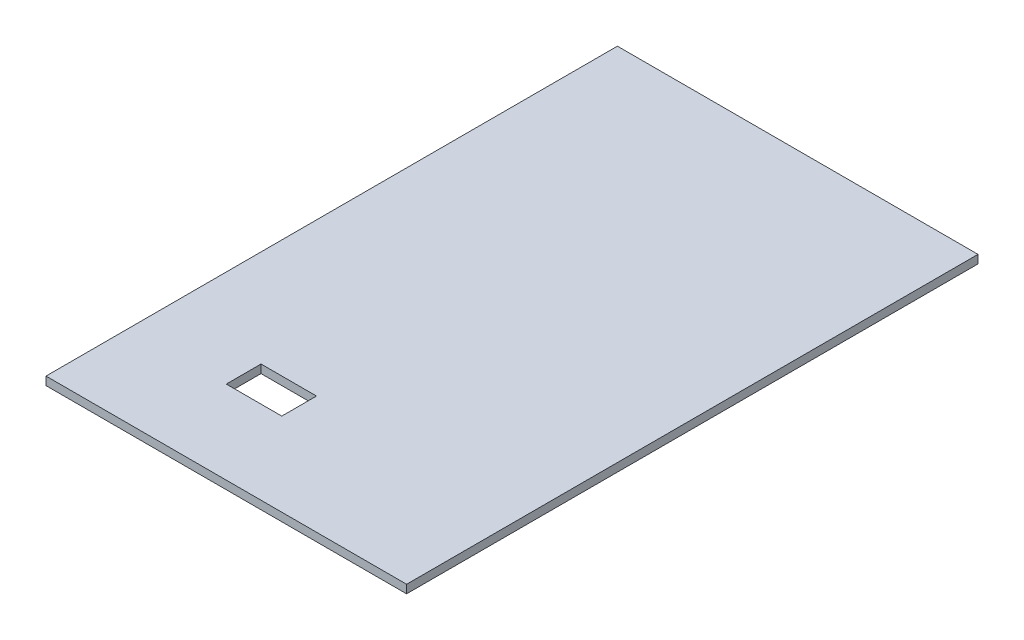
ISO-10303-21;
HEADER;
FILE_DESCRIPTION(('STEP AP214'),'2;1');
FILE_NAME('part.step','',(''),(''),'','','');
FILE_SCHEMA(('AUTOMOTIVE_DESIGN { 1 0 10303 214 1 1 1 1 }'));
ENDSEC;
DATA;
#1=APPLICATION_CONTEXT('core data for automotive mechanical design processes');
#2=APPLICATION_PROTOCOL_DEFINITION('international standard','automotive_design',2000,#1);
#3=PRODUCT_CONTEXT('',#1,'mechanical');
#4=PRODUCT('Part','Part','',(#3));
#5=PRODUCT_RELATED_PRODUCT_CATEGORY('part','',(#4));
#6=PRODUCT_DEFINITION_FORMATION('','',#4);
#7=PRODUCT_DEFINITION_CONTEXT('part definition',#1,'design');
#8=PRODUCT_DEFINITION('design','',#6,#7);
#9=PRODUCT_DEFINITION_SHAPE('','',#8);
#10=(LENGTH_UNIT() NAMED_UNIT(*) SI_UNIT(.MILLI.,.METRE.));
#11=(NAMED_UNIT(*) PLANE_ANGLE_UNIT() SI_UNIT($,.RADIAN.));
#12=(NAMED_UNIT(*) SI_UNIT($,.STERADIAN.) SOLID_ANGLE_UNIT());
#13=UNCERTAINTY_MEASURE_WITH_UNIT(LENGTH_MEASURE(1.E-05),#10,'distance_accuracy_value','');
#14=(GEOMETRIC_REPRESENTATION_CONTEXT(3) GLOBAL_UNCERTAINTY_ASSIGNED_CONTEXT((#13)) GLOBAL_UNIT_ASSIGNED_CONTEXT((#10,
#11,#12)) REPRESENTATION_CONTEXT('',''));
#15=CARTESIAN_POINT('',(0.,0.,0.));
#16=DIRECTION('',(0.,0.,1.));
#17=DIRECTION('',(1.,0.,0.));
#18=AXIS2_PLACEMENT_3D('',#15,#16,#17);
#19=CARTESIAN_POINT('',(65.,3.,-103.));
#20=DIRECTION('',(-1.,0.,0.));
#21=DIRECTION('',(0.,0.,1.));
#22=AXIS2_PLACEMENT_3D('',#19,#20,#21);
#23=PLANE('',#22);
#24=DIRECTION('',(0.,0.,-1.));
#25=VECTOR('',#24,1.);
#26=CARTESIAN_POINT('',(65.,0.,-103.));
#27=LINE('',#26,#25);
#28=CARTESIAN_POINT('',(65.,0.,103.));
#29=VERTEX_POINT('',#28);
#30=CARTESIAN_POINT('',(65.,0.,-103.));
#31=VERTEX_POINT('',#30);
#32=EDGE_CURVE('E128',#29,#31,#27,.T.);
#33=ORIENTED_EDGE('',*,*,#32,.T.);
#34=DIRECTION('',(0.,-1.,0.));
#35=VECTOR('',#34,1.);
#36=CARTESIAN_POINT('',(65.,3.,-103.));
#37=LINE('',#36,#35);
#38=CARTESIAN_POINT('',(65.,3.,-103.));
#39=VERTEX_POINT('',#38);
#40=EDGE_CURVE('E157',#39,#31,#37,.T.);
#41=ORIENTED_EDGE('',*,*,#40,.F.);
#42=DIRECTION('',(0.,0.,-1.));
#43=VECTOR('',#42,1.);
#44=CARTESIAN_POINT('',(65.,3.,-103.));
#45=LINE('',#44,#43);
#46=CARTESIAN_POINT('',(65.,3.,103.));
#47=VERTEX_POINT('',#46);
#48=EDGE_CURVE('E131',#47,#39,#45,.T.);
#49=ORIENTED_EDGE('',*,*,#48,.F.);
#50=DIRECTION('',(0.,-1.,0.));
#51=VECTOR('',#50,1.);
#52=CARTESIAN_POINT('',(65.,3.,103.));
#53=LINE('',#52,#51);
#54=EDGE_CURVE('E141',#47,#29,#53,.T.);
#55=ORIENTED_EDGE('',*,*,#54,.T.);
#56=EDGE_LOOP('',(#33,#41,#49,#55));
#57=FACE_BOUND('',#56,.T.);
#58=ADVANCED_FACE('F38',(#57),#23,.F.);
#59=CARTESIAN_POINT('',(-65.,3.,-103.));
#60=DIRECTION('',(0.,0.,1.));
#61=DIRECTION('',(1.,0.,0.));
#62=AXIS2_PLACEMENT_3D('',#59,#60,#61);
#63=PLANE('',#62);
#64=DIRECTION('',(-1.,0.,0.));
#65=VECTOR('',#64,1.);
#66=CARTESIAN_POINT('',(-65.,0.,-103.));
#67=LINE('',#66,#65);
#68=CARTESIAN_POINT('',(-65.,0.,-103.));
#69=VERTEX_POINT('',#68);
#70=EDGE_CURVE('E144',#31,#69,#67,.T.);
#71=ORIENTED_EDGE('',*,*,#70,.T.);
#72=DIRECTION('',(0.,-1.,0.));
#73=VECTOR('',#72,1.);
#74=CARTESIAN_POINT('',(-65.,3.,-103.));
#75=LINE('',#74,#73);
#76=CARTESIAN_POINT('',(-65.,3.,-103.));
#77=VERTEX_POINT('',#76);
#78=EDGE_CURVE('E154',#77,#69,#75,.T.);
#79=ORIENTED_EDGE('',*,*,#78,.F.);
#80=DIRECTION('',(-1.,0.,0.));
#81=VECTOR('',#80,1.);
#82=CARTESIAN_POINT('',(-65.,3.,-103.));
#83=LINE('',#82,#81);
#84=EDGE_CURVE('E134',#39,#77,#83,.T.);
#85=ORIENTED_EDGE('',*,*,#84,.F.);
#86=ORIENTED_EDGE('',*,*,#40,.T.);
#87=EDGE_LOOP('',(#71,#79,#85,#86));
#88=FACE_BOUND('',#87,.T.);
#89=ADVANCED_FACE('F181',(#88),#63,.F.);
#90=CARTESIAN_POINT('',(-65.,3.,-103.));
#91=DIRECTION('',(1.,0.,0.));
#92=DIRECTION('',(0.,0.,-1.));
#93=AXIS2_PLACEMENT_3D('',#90,#91,#92);
#94=PLANE('',#93);
#95=DIRECTION('',(0.,0.,1.));
#96=VECTOR('',#95,1.);
#97=CARTESIAN_POINT('',(-65.,0.,-103.));
#98=LINE('',#97,#96);
#99=CARTESIAN_POINT('',(-65.,0.,103.));
#100=VERTEX_POINT('',#99);
#101=EDGE_CURVE('E146',#69,#100,#98,.T.);
#102=ORIENTED_EDGE('',*,*,#101,.T.);
#103=DIRECTION('',(0.,-1.,0.));
#104=VECTOR('',#103,1.);
#105=CARTESIAN_POINT('',(-65.,3.,103.));
#106=LINE('',#105,#104);
#107=CARTESIAN_POINT('',(-65.,3.,103.));
#108=VERTEX_POINT('',#107);
#109=EDGE_CURVE('E151',#108,#100,#106,.T.);
#110=ORIENTED_EDGE('',*,*,#109,.F.);
#111=DIRECTION('',(0.,0.,1.));
#112=VECTOR('',#111,1.);
#113=CARTESIAN_POINT('',(-65.,3.,-103.));
#114=LINE('',#113,#112);
#115=EDGE_CURVE('E137',#77,#108,#114,.T.);
#116=ORIENTED_EDGE('',*,*,#115,.F.);
#117=ORIENTED_EDGE('',*,*,#78,.T.);
#118=EDGE_LOOP('',(#102,#110,#116,#117));
#119=FACE_BOUND('',#118,.T.);
#120=ADVANCED_FACE('F186',(#119),#94,.F.);
#121=CARTESIAN_POINT('',(-65.,3.,103.));
#122=DIRECTION('',(0.,0.,-1.));
#123=DIRECTION('',(-1.,0.,0.));
#124=AXIS2_PLACEMENT_3D('',#121,#122,#123);
#125=PLANE('',#124);
#126=DIRECTION('',(1.,0.,0.));
#127=VECTOR('',#126,1.);
#128=CARTESIAN_POINT('',(-65.,0.,103.));
#129=LINE('',#128,#127);
#130=EDGE_CURVE('E135',#100,#29,#129,.T.);
#131=ORIENTED_EDGE('',*,*,#130,.T.);
#132=ORIENTED_EDGE('',*,*,#54,.F.);
#133=DIRECTION('',(1.,0.,0.));
#134=VECTOR('',#133,1.);
#135=CARTESIAN_POINT('',(-65.,3.,103.));
#136=LINE('',#135,#134);
#137=EDGE_CURVE('E139',#108,#47,#136,.T.);
#138=ORIENTED_EDGE('',*,*,#137,.F.);
#139=ORIENTED_EDGE('',*,*,#109,.T.);
#140=EDGE_LOOP('',(#131,#132,#138,#139));
#141=FACE_BOUND('',#140,.T.);
#142=ADVANCED_FACE('F199',(#141),#125,.F.);
#143=CARTESIAN_POINT('',(0.,3.,0.));
#144=DIRECTION('',(0.,1.,0.));
#145=DIRECTION('',(0.,0.,1.));
#146=AXIS2_PLACEMENT_3D('',#143,#144,#145);
#147=PLANE('',#146);
#148=DIRECTION('',(0.,0.,1.));
#149=VECTOR('',#148,1.);
#150=CARTESIAN_POINT('',(-30.,3.,60.48));
#151=LINE('',#150,#149);
#152=CARTESIAN_POINT('',(-30.,3.,60.48));
#153=VERTEX_POINT('',#152);
#154=CARTESIAN_POINT('',(-30.,3.,73.));
#155=VERTEX_POINT('',#154);
#156=EDGE_CURVE('E52',#153,#155,#151,.T.);
#157=ORIENTED_EDGE('',*,*,#156,.F.);
#158=DIRECTION('',(-1.,0.,0.));
#159=VECTOR('',#158,1.);
#160=CARTESIAN_POINT('',(-30.,3.,60.48));
#161=LINE('',#160,#159);
#162=CARTESIAN_POINT('',(-10.,3.,60.48));
#163=VERTEX_POINT('',#162);
#164=EDGE_CURVE('E121',#163,#153,#161,.T.);
#165=ORIENTED_EDGE('',*,*,#164,.F.);
#166=DIRECTION('',(0.,0.,-1.));
#167=VECTOR('',#166,1.);
#168=CARTESIAN_POINT('',(-10.,3.,60.48));
#169=LINE('',#168,#167);
#170=CARTESIAN_POINT('',(-10.,3.,73.));
#171=VERTEX_POINT('',#170);
#172=EDGE_CURVE('E105',#171,#163,#169,.T.);
#173=ORIENTED_EDGE('',*,*,#172,.F.);
#174=DIRECTION('',(1.,0.,0.));
#175=VECTOR('',#174,1.);
#176=CARTESIAN_POINT('',(-30.,3.,73.));
#177=LINE('',#176,#175);
#178=EDGE_CURVE('E114',#155,#171,#177,.T.);
#179=ORIENTED_EDGE('',*,*,#178,.F.);
#180=EDGE_LOOP('',(#157,#165,#173,#179));
#181=FACE_BOUND('',#180,.T.);
#182=ORIENTED_EDGE('',*,*,#48,.T.);
#183=ORIENTED_EDGE('',*,*,#84,.T.);
#184=ORIENTED_EDGE('',*,*,#115,.T.);
#185=ORIENTED_EDGE('',*,*,#137,.T.);
#186=EDGE_LOOP('',(#182,#183,#184,#185));
#187=FACE_BOUND('',#186,.T.);
#188=ADVANCED_FACE('F118',(#181,#187),#147,.T.);
#189=CARTESIAN_POINT('',(0.,0.,0.));
#190=DIRECTION('',(0.,1.,0.));
#191=DIRECTION('',(0.,0.,1.));
#192=AXIS2_PLACEMENT_3D('',#189,#190,#191);
#193=PLANE('',#192);
#194=DIRECTION('',(-1.,0.,0.));
#195=VECTOR('',#194,1.);
#196=CARTESIAN_POINT('',(0.,0.,60.48));
#197=LINE('',#196,#195);
#198=CARTESIAN_POINT('',(-10.,0.,60.48));
#199=VERTEX_POINT('',#198);
#200=CARTESIAN_POINT('',(-30.,0.,60.48));
#201=VERTEX_POINT('',#200);
#202=EDGE_CURVE('E45',#199,#201,#197,.T.);
#203=ORIENTED_EDGE('',*,*,#202,.T.);
#204=DIRECTION('',(0.,0.,1.));
#205=VECTOR('',#204,1.);
#206=CARTESIAN_POINT('',(-30.,0.,0.));
#207=LINE('',#206,#205);
#208=CARTESIAN_POINT('',(-30.,0.,73.));
#209=VERTEX_POINT('',#208);
#210=EDGE_CURVE('E11',#201,#209,#207,.T.);
#211=ORIENTED_EDGE('',*,*,#210,.T.);
#212=DIRECTION('',(1.,0.,0.));
#213=VECTOR('',#212,1.);
#214=CARTESIAN_POINT('',(0.,0.,73.));
#215=LINE('',#214,#213);
#216=CARTESIAN_POINT('',(-10.,0.,73.));
#217=VERTEX_POINT('',#216);
#218=EDGE_CURVE('E160',#209,#217,#215,.T.);
#219=ORIENTED_EDGE('',*,*,#218,.T.);
#220=DIRECTION('',(0.,0.,-1.));
#221=VECTOR('',#220,1.);
#222=CARTESIAN_POINT('',(-10.,0.,0.));
#223=LINE('',#222,#221);
#224=EDGE_CURVE('E108',#217,#199,#223,.T.);
#225=ORIENTED_EDGE('',*,*,#224,.T.);
#226=EDGE_LOOP('',(#203,#211,#219,#225));
#227=FACE_BOUND('',#226,.T.);
#228=ORIENTED_EDGE('',*,*,#32,.F.);
#229=ORIENTED_EDGE('',*,*,#130,.F.);
#230=ORIENTED_EDGE('',*,*,#101,.F.);
#231=ORIENTED_EDGE('',*,*,#70,.F.);
#232=EDGE_LOOP('',(#228,#229,#230,#231));
#233=FACE_BOUND('',#232,.T.);
#234=ADVANCED_FACE('F164',(#227,#233),#193,.F.);
#235=CARTESIAN_POINT('',(-30.,-1.,60.48));
#236=DIRECTION('',(-1.,0.,0.));
#237=DIRECTION('',(0.,0.,1.));
#238=AXIS2_PLACEMENT_3D('',#235,#236,#237);
#239=PLANE('',#238);
#240=DIRECTION('',(0.,1.,0.));
#241=VECTOR('',#240,1.);
#242=CARTESIAN_POINT('',(-30.,-1.,60.48));
#243=LINE('',#242,#241);
#244=EDGE_CURVE('E126',#201,#153,#243,.T.);
#245=ORIENTED_EDGE('',*,*,#244,.T.);
#246=ORIENTED_EDGE('',*,*,#156,.T.);
#247=DIRECTION('',(0.,1.,0.));
#248=VECTOR('',#247,1.);
#249=CARTESIAN_POINT('',(-30.,-1.,73.));
#250=LINE('',#249,#248);
#251=EDGE_CURVE('E111',#209,#155,#250,.T.);
#252=ORIENTED_EDGE('',*,*,#251,.F.);
#253=ORIENTED_EDGE('',*,*,#210,.F.);
#254=EDGE_LOOP('',(#245,#246,#252,#253));
#255=FACE_BOUND('',#254,.T.);
#256=ADVANCED_FACE('F169',(#255),#239,.F.);
#257=CARTESIAN_POINT('',(-30.,-1.,60.48));
#258=DIRECTION('',(0.,0.,-1.));
#259=DIRECTION('',(-1.,0.,0.));
#260=AXIS2_PLACEMENT_3D('',#257,#258,#259);
#261=PLANE('',#260);
#262=DIRECTION('',(0.,1.,0.));
#263=VECTOR('',#262,1.);
#264=CARTESIAN_POINT('',(-10.,-1.,60.48));
#265=LINE('',#264,#263);
#266=EDGE_CURVE('E110',#199,#163,#265,.T.);
#267=ORIENTED_EDGE('',*,*,#266,.T.);
#268=ORIENTED_EDGE('',*,*,#164,.T.);
#269=ORIENTED_EDGE('',*,*,#244,.F.);
#270=ORIENTED_EDGE('',*,*,#202,.F.);
#271=EDGE_LOOP('',(#267,#268,#269,#270));
#272=FACE_BOUND('',#271,.T.);
#273=ADVANCED_FACE('F168',(#272),#261,.F.);
#274=CARTESIAN_POINT('',(-10.,-1.,60.48));
#275=DIRECTION('',(1.,0.,0.));
#276=DIRECTION('',(0.,0.,-1.));
#277=AXIS2_PLACEMENT_3D('',#274,#275,#276);
#278=PLANE('',#277);
#279=DIRECTION('',(0.,1.,0.));
#280=VECTOR('',#279,1.);
#281=CARTESIAN_POINT('',(-10.,-1.,73.));
#282=LINE('',#281,#280);
#283=EDGE_CURVE('E60',#217,#171,#282,.T.);
#284=ORIENTED_EDGE('',*,*,#283,.T.);
#285=ORIENTED_EDGE('',*,*,#172,.T.);
#286=ORIENTED_EDGE('',*,*,#266,.F.);
#287=ORIENTED_EDGE('',*,*,#224,.F.);
#288=EDGE_LOOP('',(#284,#285,#286,#287));
#289=FACE_BOUND('',#288,.T.);
#290=ADVANCED_FACE('F102',(#289),#278,.F.);
#291=CARTESIAN_POINT('',(-30.,-1.,73.));
#292=DIRECTION('',(0.,0.,1.));
#293=DIRECTION('',(1.,0.,0.));
#294=AXIS2_PLACEMENT_3D('',#291,#292,#293);
#295=PLANE('',#294);
#296=ORIENTED_EDGE('',*,*,#251,.T.);
#297=ORIENTED_EDGE('',*,*,#178,.T.);
#298=ORIENTED_EDGE('',*,*,#283,.F.);
#299=ORIENTED_EDGE('',*,*,#218,.F.);
#300=EDGE_LOOP('',(#296,#297,#298,#299));
#301=FACE_BOUND('',#300,.T.);
#302=ADVANCED_FACE('F115',(#301),#295,.F.);
#303=CLOSED_SHELL('',(#58,#89,#120,#142,#188,#234,#256,#273,#290,#302));
#304=MANIFOLD_SOLID_BREP('B2',#303);
#305=ADVANCED_BREP_SHAPE_REPRESENTATION('',(#18,#304),#14);
#306=SHAPE_DEFINITION_REPRESENTATION(#9,#305);
ENDSEC;
END-ISO-10303-21;
